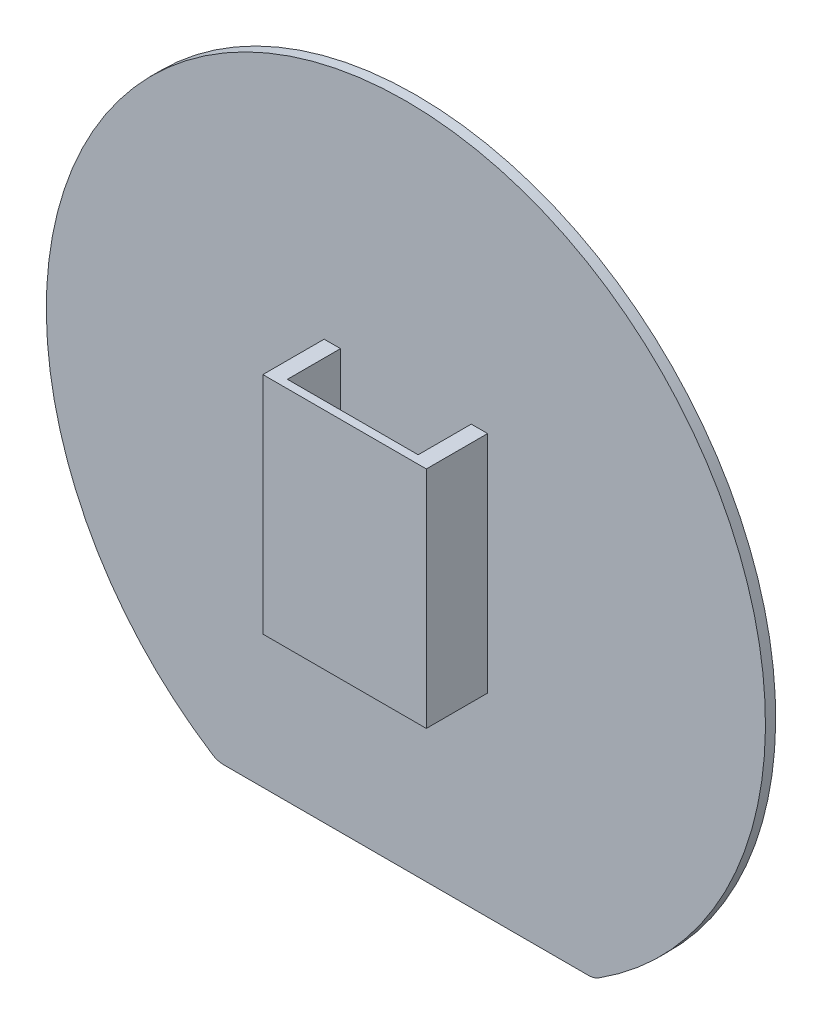
ISO-10303-21;
HEADER;
FILE_DESCRIPTION(('STEP AP214'),'2;1');
FILE_NAME('part.step','',(''),(''),'','','');
FILE_SCHEMA(('AUTOMOTIVE_DESIGN { 1 0 10303 214 1 1 1 1 }'));
ENDSEC;
DATA;
#1=APPLICATION_CONTEXT('core data for automotive mechanical design processes');
#2=APPLICATION_PROTOCOL_DEFINITION('international standard','automotive_design',2000,#1);
#3=PRODUCT_CONTEXT('',#1,'mechanical');
#4=PRODUCT('Part','Part','',(#3));
#5=PRODUCT_RELATED_PRODUCT_CATEGORY('part','',(#4));
#6=PRODUCT_DEFINITION_FORMATION('','',#4);
#7=PRODUCT_DEFINITION_CONTEXT('part definition',#1,'design');
#8=PRODUCT_DEFINITION('design','',#6,#7);
#9=PRODUCT_DEFINITION_SHAPE('','',#8);
#10=(LENGTH_UNIT() NAMED_UNIT(*) SI_UNIT(.MILLI.,.METRE.));
#11=(NAMED_UNIT(*) PLANE_ANGLE_UNIT() SI_UNIT($,.RADIAN.));
#12=(NAMED_UNIT(*) SI_UNIT($,.STERADIAN.) SOLID_ANGLE_UNIT());
#13=UNCERTAINTY_MEASURE_WITH_UNIT(LENGTH_MEASURE(1.E-05),#10,'distance_accuracy_value','');
#14=(GEOMETRIC_REPRESENTATION_CONTEXT(3) GLOBAL_UNCERTAINTY_ASSIGNED_CONTEXT((#13)) GLOBAL_UNIT_ASSIGNED_CONTEXT((#10,
#11,#12)) REPRESENTATION_CONTEXT('',''));
#15=CARTESIAN_POINT('',(0.,0.,0.));
#16=DIRECTION('',(0.,0.,1.));
#17=DIRECTION('',(1.,0.,0.));
#18=AXIS2_PLACEMENT_3D('',#15,#16,#17);
#19=CARTESIAN_POINT('',(0.,0.,0.));
#20=DIRECTION('',(0.,0.,1.));
#21=DIRECTION('',(1.,0.,0.));
#22=AXIS2_PLACEMENT_3D('',#19,#20,#21);
#23=PLANE('',#22);
#24=DIRECTION('',(-1.,0.,0.));
#25=VECTOR('',#24,1.);
#26=CARTESIAN_POINT('',(-20.,27.5,0.));
#27=LINE('',#26,#25);
#28=CARTESIAN_POINT('',(-16.,27.5,0.));
#29=VERTEX_POINT('',#28);
#30=CARTESIAN_POINT('',(-20.,27.5,0.));
#31=VERTEX_POINT('',#30);
#32=EDGE_CURVE('E284',#29,#31,#27,.T.);
#33=ORIENTED_EDGE('',*,*,#32,.F.);
#34=DIRECTION('',(0.,-1.,0.));
#35=VECTOR('',#34,1.);
#36=CARTESIAN_POINT('',(-16.,88.,0.));
#37=LINE('',#36,#35);
#38=CARTESIAN_POINT('',(-16.,-27.5,0.));
#39=VERTEX_POINT('',#38);
#40=EDGE_CURVE('E137',#29,#39,#37,.T.);
#41=ORIENTED_EDGE('',*,*,#40,.T.);
#42=DIRECTION('',(1.,0.,0.));
#43=VECTOR('',#42,1.);
#44=CARTESIAN_POINT('',(-20.,-27.5,0.));
#45=LINE('',#44,#43);
#46=CARTESIAN_POINT('',(-20.,-27.5,0.));
#47=VERTEX_POINT('',#46);
#48=EDGE_CURVE('E153',#47,#39,#45,.T.);
#49=ORIENTED_EDGE('',*,*,#48,.F.);
#50=DIRECTION('',(0.,-1.,0.));
#51=VECTOR('',#50,1.);
#52=CARTESIAN_POINT('',(-20.,-27.5,0.));
#53=LINE('',#52,#51);
#54=EDGE_CURVE('E154',#31,#47,#53,.T.);
#55=ORIENTED_EDGE('',*,*,#54,.F.);
#56=EDGE_LOOP('',(#33,#41,#49,#55));
#57=FACE_BOUND('',#56,.T.);
#58=CARTESIAN_POINT('',(0.,0.,0.));
#59=DIRECTION('',(0.,0.,1.));
#60=DIRECTION('',(1.,0.,0.));
#61=AXIS2_PLACEMENT_3D('',#58,#59,#60);
#62=CIRCLE('',#61,88.);
#63=CARTESIAN_POINT('',(47.2848451721938,-74.2168674698795,0.));
#64=VERTEX_POINT('',#63);
#65=CARTESIAN_POINT('',(-47.2848451721938,-74.2168674698795,0.));
#66=VERTEX_POINT('',#65);
#67=EDGE_CURVE('E176',#64,#66,#62,.T.);
#68=ORIENTED_EDGE('',*,*,#67,.T.);
#69=CARTESIAN_POINT('',(-44.5982062419555,-70.,0.));
#70=DIRECTION('',(0.,0.,1.));
#71=DIRECTION('',(1.,0.,0.));
#72=AXIS2_PLACEMENT_3D('',#69,#70,#71);
#73=CIRCLE('',#72,5.);
#74=CARTESIAN_POINT('',(-44.5982062419555,-75.,0.));
#75=VERTEX_POINT('',#74);
#76=EDGE_CURVE('E190',#66,#75,#73,.T.);
#77=ORIENTED_EDGE('',*,*,#76,.T.);
#78=DIRECTION('',(1.,0.,0.));
#79=VECTOR('',#78,1.);
#80=CARTESIAN_POINT('',(0.,-75.,0.));
#81=LINE('',#80,#79);
#82=CARTESIAN_POINT('',(44.5982062419555,-75.,0.));
#83=VERTEX_POINT('',#82);
#84=EDGE_CURVE('E172',#75,#83,#81,.T.);
#85=ORIENTED_EDGE('',*,*,#84,.T.);
#86=CARTESIAN_POINT('',(44.5982062419555,-70.,0.));
#87=DIRECTION('',(0.,0.,1.));
#88=DIRECTION('',(1.,0.,0.));
#89=AXIS2_PLACEMENT_3D('',#86,#87,#88);
#90=CIRCLE('',#89,5.);
#91=EDGE_CURVE('E188',#83,#64,#90,.T.);
#92=ORIENTED_EDGE('',*,*,#91,.T.);
#93=EDGE_LOOP('',(#68,#77,#85,#92));
#94=FACE_BOUND('',#93,.T.);
#95=DIRECTION('',(0.,-1.,0.));
#96=VECTOR('',#95,1.);
#97=CARTESIAN_POINT('',(16.,88.,0.));
#98=LINE('',#97,#96);
#99=CARTESIAN_POINT('',(16.,27.5,0.));
#100=VERTEX_POINT('',#99);
#101=CARTESIAN_POINT('',(16.,-27.5,0.));
#102=VERTEX_POINT('',#101);
#103=EDGE_CURVE('E124',#100,#102,#98,.T.);
#104=ORIENTED_EDGE('',*,*,#103,.F.);
#105=CARTESIAN_POINT('',(20.,27.5,0.));
#106=VERTEX_POINT('',#105);
#107=EDGE_CURVE('E158',#106,#100,#27,.T.);
#108=ORIENTED_EDGE('',*,*,#107,.F.);
#109=DIRECTION('',(0.,1.,0.));
#110=VECTOR('',#109,1.);
#111=CARTESIAN_POINT('',(20.,-27.5,0.));
#112=LINE('',#111,#110);
#113=CARTESIAN_POINT('',(20.,-27.5,0.));
#114=VERTEX_POINT('',#113);
#115=EDGE_CURVE('E152',#114,#106,#112,.T.);
#116=ORIENTED_EDGE('',*,*,#115,.F.);
#117=EDGE_CURVE('E143',#102,#114,#45,.T.);
#118=ORIENTED_EDGE('',*,*,#117,.F.);
#119=EDGE_LOOP('',(#104,#108,#116,#118));
#120=FACE_BOUND('',#119,.T.);
#121=ADVANCED_FACE('F35',(#57,#94,#120),#23,.T.);
#122=CARTESIAN_POINT('',(0.,-75.,-2.5));
#123=DIRECTION('',(0.,-1.,0.));
#124=DIRECTION('',(0.,0.,-1.));
#125=AXIS2_PLACEMENT_3D('',#122,#123,#124);
#126=PLANE('',#125);
#127=ORIENTED_EDGE('',*,*,#84,.F.);
#128=DIRECTION('',(0.,0.,1.));
#129=VECTOR('',#128,1.);
#130=CARTESIAN_POINT('',(-44.5982062419555,-75.,-2.5));
#131=LINE('',#130,#129);
#132=CARTESIAN_POINT('',(-44.5982062419555,-75.,-2.5));
#133=VERTEX_POINT('',#132);
#134=EDGE_CURVE('E56',#75,#133,#131,.F.);
#135=ORIENTED_EDGE('',*,*,#134,.T.);
#136=DIRECTION('',(1.,0.,0.));
#137=VECTOR('',#136,1.);
#138=CARTESIAN_POINT('',(0.,-75.,-2.5));
#139=LINE('',#138,#137);
#140=CARTESIAN_POINT('',(44.5982062419555,-75.,-2.5));
#141=VERTEX_POINT('',#140);
#142=EDGE_CURVE('E173',#133,#141,#139,.T.);
#143=ORIENTED_EDGE('',*,*,#142,.T.);
#144=DIRECTION('',(0.,0.,1.));
#145=VECTOR('',#144,1.);
#146=CARTESIAN_POINT('',(44.5982062419555,-75.,-2.5));
#147=LINE('',#146,#145);
#148=EDGE_CURVE('E192',#141,#83,#147,.T.);
#149=ORIENTED_EDGE('',*,*,#148,.T.);
#150=EDGE_LOOP('',(#127,#135,#143,#149));
#151=FACE_BOUND('',#150,.T.);
#152=ADVANCED_FACE('F196',(#151),#126,.T.);
#153=CARTESIAN_POINT('',(0.,0.,-2.5));
#154=DIRECTION('',(0.,0.,1.));
#155=DIRECTION('',(1.,0.,0.));
#156=AXIS2_PLACEMENT_3D('',#153,#154,#155);
#157=CYLINDRICAL_SURFACE('',#156,88.);
#158=CARTESIAN_POINT('',(0.,0.,-2.5));
#159=DIRECTION('',(0.,0.,1.));
#160=DIRECTION('',(1.,0.,0.));
#161=AXIS2_PLACEMENT_3D('',#158,#159,#160);
#162=CIRCLE('',#161,88.);
#163=CARTESIAN_POINT('',(47.2848451721938,-74.2168674698795,-2.5));
#164=VERTEX_POINT('',#163);
#165=CARTESIAN_POINT('',(-47.2848451721938,-74.2168674698795,-2.5));
#166=VERTEX_POINT('',#165);
#167=EDGE_CURVE('E175',#164,#166,#162,.T.);
#168=ORIENTED_EDGE('',*,*,#167,.T.);
#169=DIRECTION('',(0.,0.,1.));
#170=VECTOR('',#169,1.);
#171=CARTESIAN_POINT('',(-47.2848451721938,-74.2168674698795,-2.5));
#172=LINE('',#171,#170);
#173=EDGE_CURVE('E185',#166,#66,#172,.T.);
#174=ORIENTED_EDGE('',*,*,#173,.T.);
#175=ORIENTED_EDGE('',*,*,#67,.F.);
#176=DIRECTION('',(0.,0.,1.));
#177=VECTOR('',#176,1.);
#178=CARTESIAN_POINT('',(47.2848451721938,-74.2168674698795,-2.5));
#179=LINE('',#178,#177);
#180=EDGE_CURVE('E179',#64,#164,#179,.F.);
#181=ORIENTED_EDGE('',*,*,#180,.T.);
#182=EDGE_LOOP('',(#168,#174,#175,#181));
#183=FACE_BOUND('',#182,.T.);
#184=ADVANCED_FACE('F205',(#183),#157,.T.);
#185=CARTESIAN_POINT('',(0.,0.,-2.5));
#186=DIRECTION('',(0.,0.,1.));
#187=DIRECTION('',(1.,0.,0.));
#188=AXIS2_PLACEMENT_3D('',#185,#186,#187);
#189=PLANE('',#188);
#190=ORIENTED_EDGE('',*,*,#142,.F.);
#191=CARTESIAN_POINT('',(-44.5982062419555,-70.,-2.5));
#192=DIRECTION('',(0.,0.,1.));
#193=DIRECTION('',(1.,0.,0.));
#194=AXIS2_PLACEMENT_3D('',#191,#192,#193);
#195=CIRCLE('',#194,5.);
#196=EDGE_CURVE('E11',#133,#166,#195,.F.);
#197=ORIENTED_EDGE('',*,*,#196,.T.);
#198=ORIENTED_EDGE('',*,*,#167,.F.);
#199=CARTESIAN_POINT('',(44.5982062419555,-70.,-2.5));
#200=DIRECTION('',(0.,0.,1.));
#201=DIRECTION('',(1.,0.,0.));
#202=AXIS2_PLACEMENT_3D('',#199,#200,#201);
#203=CIRCLE('',#202,5.);
#204=EDGE_CURVE('E43',#164,#141,#203,.F.);
#205=ORIENTED_EDGE('',*,*,#204,.T.);
#206=EDGE_LOOP('',(#190,#197,#198,#205));
#207=FACE_BOUND('',#206,.T.);
#208=ADVANCED_FACE('F207',(#207),#189,.F.);
#209=CARTESIAN_POINT('',(20.,-27.5,15.));
#210=DIRECTION('',(-1.,0.,0.));
#211=DIRECTION('',(0.,0.,1.));
#212=AXIS2_PLACEMENT_3D('',#209,#210,#211);
#213=PLANE('',#212);
#214=ORIENTED_EDGE('',*,*,#115,.T.);
#215=DIRECTION('',(0.,0.,-1.));
#216=VECTOR('',#215,1.);
#217=CARTESIAN_POINT('',(20.,27.5,15.));
#218=LINE('',#217,#216);
#219=CARTESIAN_POINT('',(20.,27.5,15.));
#220=VERTEX_POINT('',#219);
#221=EDGE_CURVE('E170',#220,#106,#218,.T.);
#222=ORIENTED_EDGE('',*,*,#221,.F.);
#223=DIRECTION('',(0.,1.,0.));
#224=VECTOR('',#223,1.);
#225=CARTESIAN_POINT('',(20.,-27.5,15.));
#226=LINE('',#225,#224);
#227=CARTESIAN_POINT('',(20.,-27.5,15.));
#228=VERTEX_POINT('',#227);
#229=EDGE_CURVE('E156',#228,#220,#226,.T.);
#230=ORIENTED_EDGE('',*,*,#229,.F.);
#231=DIRECTION('',(0.,0.,-1.));
#232=VECTOR('',#231,1.);
#233=CARTESIAN_POINT('',(20.,-27.5,15.));
#234=LINE('',#233,#232);
#235=EDGE_CURVE('E162',#228,#114,#234,.T.);
#236=ORIENTED_EDGE('',*,*,#235,.T.);
#237=EDGE_LOOP('',(#214,#222,#230,#236));
#238=FACE_BOUND('',#237,.T.);
#239=ADVANCED_FACE('F228',(#238),#213,.F.);
#240=CARTESIAN_POINT('',(-20.,27.5,15.));
#241=DIRECTION('',(0.,-1.,0.));
#242=DIRECTION('',(0.,0.,-1.));
#243=AXIS2_PLACEMENT_3D('',#240,#241,#242);
#244=PLANE('',#243);
#245=DIRECTION('',(-1.,0.,0.));
#246=VECTOR('',#245,1.);
#247=CARTESIAN_POINT('',(-20.,27.5,13.));
#248=LINE('',#247,#246);
#249=CARTESIAN_POINT('',(16.,27.5,13.));
#250=VERTEX_POINT('',#249);
#251=CARTESIAN_POINT('',(-16.,27.5,13.));
#252=VERTEX_POINT('',#251);
#253=EDGE_CURVE('E264',#250,#252,#248,.T.);
#254=ORIENTED_EDGE('',*,*,#253,.T.);
#255=DIRECTION('',(0.,0.,-1.));
#256=VECTOR('',#255,1.);
#257=CARTESIAN_POINT('',(-16.,27.5,15.));
#258=LINE('',#257,#256);
#259=EDGE_CURVE('E274',#252,#29,#258,.T.);
#260=ORIENTED_EDGE('',*,*,#259,.T.);
#261=ORIENTED_EDGE('',*,*,#32,.T.);
#262=DIRECTION('',(0.,0.,-1.));
#263=VECTOR('',#262,1.);
#264=CARTESIAN_POINT('',(-20.,27.5,15.));
#265=LINE('',#264,#263);
#266=CARTESIAN_POINT('',(-20.,27.5,15.));
#267=VERTEX_POINT('',#266);
#268=EDGE_CURVE('E167',#267,#31,#265,.T.);
#269=ORIENTED_EDGE('',*,*,#268,.F.);
#270=DIRECTION('',(-1.,0.,0.));
#271=VECTOR('',#270,1.);
#272=CARTESIAN_POINT('',(-20.,27.5,15.));
#273=LINE('',#272,#271);
#274=EDGE_CURVE('E279',#220,#267,#273,.T.);
#275=ORIENTED_EDGE('',*,*,#274,.F.);
#276=ORIENTED_EDGE('',*,*,#221,.T.);
#277=ORIENTED_EDGE('',*,*,#107,.T.);
#278=DIRECTION('',(0.,0.,1.));
#279=VECTOR('',#278,1.);
#280=CARTESIAN_POINT('',(16.,27.5,15.));
#281=LINE('',#280,#279);
#282=EDGE_CURVE('E131',#100,#250,#281,.T.);
#283=ORIENTED_EDGE('',*,*,#282,.T.);
#284=EDGE_LOOP('',(#254,#260,#261,#269,#275,#276,#277,#283));
#285=FACE_BOUND('',#284,.T.);
#286=ADVANCED_FACE('F233',(#285),#244,.F.);
#287=CARTESIAN_POINT('',(-20.,-27.5,15.));
#288=DIRECTION('',(1.,0.,0.));
#289=DIRECTION('',(0.,0.,-1.));
#290=AXIS2_PLACEMENT_3D('',#287,#288,#289);
#291=PLANE('',#290);
#292=ORIENTED_EDGE('',*,*,#54,.T.);
#293=DIRECTION('',(0.,0.,-1.));
#294=VECTOR('',#293,1.);
#295=CARTESIAN_POINT('',(-20.,-27.5,15.));
#296=LINE('',#295,#294);
#297=CARTESIAN_POINT('',(-20.,-27.5,15.));
#298=VERTEX_POINT('',#297);
#299=EDGE_CURVE('E164',#298,#47,#296,.T.);
#300=ORIENTED_EDGE('',*,*,#299,.F.);
#301=DIRECTION('',(0.,-1.,0.));
#302=VECTOR('',#301,1.);
#303=CARTESIAN_POINT('',(-20.,-27.5,15.));
#304=LINE('',#303,#302);
#305=EDGE_CURVE('E281',#267,#298,#304,.T.);
#306=ORIENTED_EDGE('',*,*,#305,.F.);
#307=ORIENTED_EDGE('',*,*,#268,.T.);
#308=EDGE_LOOP('',(#292,#300,#306,#307));
#309=FACE_BOUND('',#308,.T.);
#310=ADVANCED_FACE('F238',(#309),#291,.F.);
#311=CARTESIAN_POINT('',(-20.,-27.5,15.));
#312=DIRECTION('',(0.,1.,0.));
#313=DIRECTION('',(0.,0.,1.));
#314=AXIS2_PLACEMENT_3D('',#311,#312,#313);
#315=PLANE('',#314);
#316=ORIENTED_EDGE('',*,*,#48,.T.);
#317=DIRECTION('',(0.,0.,-1.));
#318=VECTOR('',#317,1.);
#319=CARTESIAN_POINT('',(-16.,-27.5,0.));
#320=LINE('',#319,#318);
#321=CARTESIAN_POINT('',(-16.,-27.5,13.));
#322=VERTEX_POINT('',#321);
#323=EDGE_CURVE('E148',#322,#39,#320,.T.);
#324=ORIENTED_EDGE('',*,*,#323,.F.);
#325=DIRECTION('',(-1.,0.,0.));
#326=VECTOR('',#325,1.);
#327=CARTESIAN_POINT('',(-16.,-27.5,13.));
#328=LINE('',#327,#326);
#329=CARTESIAN_POINT('',(16.,-27.5,13.));
#330=VERTEX_POINT('',#329);
#331=EDGE_CURVE('E147',#330,#322,#328,.T.);
#332=ORIENTED_EDGE('',*,*,#331,.F.);
#333=DIRECTION('',(0.,0.,1.));
#334=VECTOR('',#333,1.);
#335=CARTESIAN_POINT('',(16.,-27.5,0.));
#336=LINE('',#335,#334);
#337=EDGE_CURVE('E128',#102,#330,#336,.T.);
#338=ORIENTED_EDGE('',*,*,#337,.F.);
#339=ORIENTED_EDGE('',*,*,#117,.T.);
#340=ORIENTED_EDGE('',*,*,#235,.F.);
#341=DIRECTION('',(1.,0.,0.));
#342=VECTOR('',#341,1.);
#343=CARTESIAN_POINT('',(-20.,-27.5,15.));
#344=LINE('',#343,#342);
#345=EDGE_CURVE('E165',#298,#228,#344,.T.);
#346=ORIENTED_EDGE('',*,*,#345,.F.);
#347=ORIENTED_EDGE('',*,*,#299,.T.);
#348=EDGE_LOOP('',(#316,#324,#332,#338,#339,#340,#346,#347));
#349=FACE_BOUND('',#348,.T.);
#350=ADVANCED_FACE('F141',(#349),#315,.F.);
#351=CARTESIAN_POINT('',(0.,0.,15.));
#352=DIRECTION('',(0.,0.,-1.));
#353=DIRECTION('',(-1.,0.,0.));
#354=AXIS2_PLACEMENT_3D('',#351,#352,#353);
#355=PLANE('',#354);
#356=ORIENTED_EDGE('',*,*,#229,.T.);
#357=ORIENTED_EDGE('',*,*,#274,.T.);
#358=ORIENTED_EDGE('',*,*,#305,.T.);
#359=ORIENTED_EDGE('',*,*,#345,.T.);
#360=EDGE_LOOP('',(#356,#357,#358,#359));
#361=FACE_BOUND('',#360,.T.);
#362=ADVANCED_FACE('F247',(#361),#355,.F.);
#363=CARTESIAN_POINT('',(-16.,88.,0.));
#364=DIRECTION('',(-1.,0.,0.));
#365=DIRECTION('',(0.,0.,1.));
#366=AXIS2_PLACEMENT_3D('',#363,#364,#365);
#367=PLANE('',#366);
#368=DIRECTION('',(0.,-1.,0.));
#369=VECTOR('',#368,1.);
#370=CARTESIAN_POINT('',(-16.,88.,13.));
#371=LINE('',#370,#369);
#372=EDGE_CURVE('E265',#252,#322,#371,.T.);
#373=ORIENTED_EDGE('',*,*,#372,.T.);
#374=ORIENTED_EDGE('',*,*,#323,.T.);
#375=ORIENTED_EDGE('',*,*,#40,.F.);
#376=ORIENTED_EDGE('',*,*,#259,.F.);
#377=EDGE_LOOP('',(#373,#374,#375,#376));
#378=FACE_BOUND('',#377,.T.);
#379=ADVANCED_FACE('F250',(#378),#367,.F.);
#380=CARTESIAN_POINT('',(-16.,88.,13.));
#381=DIRECTION('',(0.,0.,1.));
#382=DIRECTION('',(1.,0.,0.));
#383=AXIS2_PLACEMENT_3D('',#380,#381,#382);
#384=PLANE('',#383);
#385=DIRECTION('',(0.,-1.,0.));
#386=VECTOR('',#385,1.);
#387=CARTESIAN_POINT('',(16.,88.,13.));
#388=LINE('',#387,#386);
#389=EDGE_CURVE('E136',#250,#330,#388,.T.);
#390=ORIENTED_EDGE('',*,*,#389,.T.);
#391=ORIENTED_EDGE('',*,*,#331,.T.);
#392=ORIENTED_EDGE('',*,*,#372,.F.);
#393=ORIENTED_EDGE('',*,*,#253,.F.);
#394=EDGE_LOOP('',(#390,#391,#392,#393));
#395=FACE_BOUND('',#394,.T.);
#396=ADVANCED_FACE('F254',(#395),#384,.F.);
#397=CARTESIAN_POINT('',(16.,88.,0.));
#398=DIRECTION('',(1.,0.,0.));
#399=DIRECTION('',(0.,0.,-1.));
#400=AXIS2_PLACEMENT_3D('',#397,#398,#399);
#401=PLANE('',#400);
#402=ORIENTED_EDGE('',*,*,#103,.T.);
#403=ORIENTED_EDGE('',*,*,#337,.T.);
#404=ORIENTED_EDGE('',*,*,#389,.F.);
#405=ORIENTED_EDGE('',*,*,#282,.F.);
#406=EDGE_LOOP('',(#402,#403,#404,#405));
#407=FACE_BOUND('',#406,.T.);
#408=ADVANCED_FACE('F126',(#407),#401,.F.);
#409=CARTESIAN_POINT('',(-44.5982062419555,-70.,-2.5));
#410=DIRECTION('',(0.,0.,1.));
#411=DIRECTION('',(1.,0.,0.));
#412=AXIS2_PLACEMENT_3D('',#409,#410,#411);
#413=CYLINDRICAL_SURFACE('',#412,5.);
#414=ORIENTED_EDGE('',*,*,#196,.F.);
#415=ORIENTED_EDGE('',*,*,#134,.F.);
#416=ORIENTED_EDGE('',*,*,#76,.F.);
#417=ORIENTED_EDGE('',*,*,#173,.F.);
#418=EDGE_LOOP('',(#414,#415,#416,#417));
#419=FACE_BOUND('',#418,.T.);
#420=ADVANCED_FACE('F203',(#419),#413,.T.);
#421=CARTESIAN_POINT('',(44.5982062419555,-70.,-2.5));
#422=DIRECTION('',(0.,0.,1.));
#423=DIRECTION('',(1.,0.,0.));
#424=AXIS2_PLACEMENT_3D('',#421,#422,#423);
#425=CYLINDRICAL_SURFACE('',#424,5.);
#426=ORIENTED_EDGE('',*,*,#204,.F.);
#427=ORIENTED_EDGE('',*,*,#180,.F.);
#428=ORIENTED_EDGE('',*,*,#91,.F.);
#429=ORIENTED_EDGE('',*,*,#148,.F.);
#430=EDGE_LOOP('',(#426,#427,#428,#429));
#431=FACE_BOUND('',#430,.T.);
#432=ADVANCED_FACE('F37',(#431),#425,.T.);
#433=CLOSED_SHELL('',(#121,#152,#184,#208,#239,#286,#310,#350,#362,#379,#396,#408,#420,#432));
#434=MANIFOLD_SOLID_BREP('B2',#433);
#435=ADVANCED_BREP_SHAPE_REPRESENTATION('',(#18,#434),#14);
#436=SHAPE_DEFINITION_REPRESENTATION(#9,#435);
ENDSEC;
END-ISO-10303-21;
